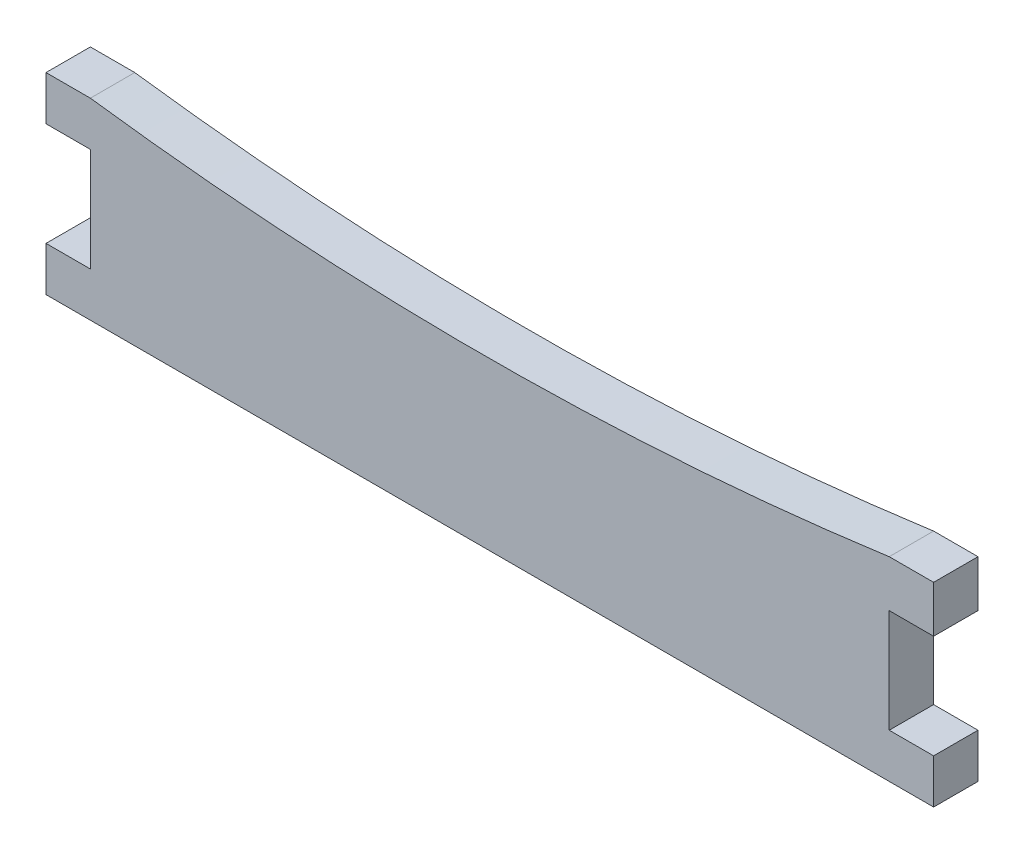
ISO-10303-21;
HEADER;
FILE_DESCRIPTION(('STEP AP214'),'2;1');
FILE_NAME('part.step','',(''),(''),'','','');
FILE_SCHEMA(('AUTOMOTIVE_DESIGN { 1 0 10303 214 1 1 1 1 }'));
ENDSEC;
DATA;
#1=APPLICATION_CONTEXT('core data for automotive mechanical design processes');
#2=APPLICATION_PROTOCOL_DEFINITION('international standard','automotive_design',2000,#1);
#3=PRODUCT_CONTEXT('',#1,'mechanical');
#4=PRODUCT('Part','Part','',(#3));
#5=PRODUCT_RELATED_PRODUCT_CATEGORY('part','',(#4));
#6=PRODUCT_DEFINITION_FORMATION('','',#4);
#7=PRODUCT_DEFINITION_CONTEXT('part definition',#1,'design');
#8=PRODUCT_DEFINITION('design','',#6,#7);
#9=PRODUCT_DEFINITION_SHAPE('','',#8);
#10=(LENGTH_UNIT() NAMED_UNIT(*) SI_UNIT(.MILLI.,.METRE.));
#11=(NAMED_UNIT(*) PLANE_ANGLE_UNIT() SI_UNIT($,.RADIAN.));
#12=(NAMED_UNIT(*) SI_UNIT($,.STERADIAN.) SOLID_ANGLE_UNIT());
#13=UNCERTAINTY_MEASURE_WITH_UNIT(LENGTH_MEASURE(1.E-05),#10,'distance_accuracy_value','');
#14=(GEOMETRIC_REPRESENTATION_CONTEXT(3) GLOBAL_UNCERTAINTY_ASSIGNED_CONTEXT((#13)) GLOBAL_UNIT_ASSIGNED_CONTEXT((#10,
#11,#12)) REPRESENTATION_CONTEXT('',''));
#15=CARTESIAN_POINT('',(0.,0.,0.));
#16=DIRECTION('',(0.,0.,1.));
#17=DIRECTION('',(1.,0.,0.));
#18=AXIS2_PLACEMENT_3D('',#15,#16,#17);
#19=CARTESIAN_POINT('',(-38.1,0.,3.81));
#20=DIRECTION('',(1.,0.,0.));
#21=DIRECTION('',(0.,0.,-1.));
#22=AXIS2_PLACEMENT_3D('',#19,#20,#21);
#23=PLANE('',#22);
#24=DIRECTION('',(0.,-1.,0.));
#25=VECTOR('',#24,1.);
#26=CARTESIAN_POINT('',(-38.1,0.,0.));
#27=LINE('',#26,#25);
#28=CARTESIAN_POINT('',(-38.1,3.81,0.));
#29=VERTEX_POINT('',#28);
#30=CARTESIAN_POINT('',(-38.1,0.,0.));
#31=VERTEX_POINT('',#30);
#32=EDGE_CURVE('E165',#29,#31,#27,.T.);
#33=ORIENTED_EDGE('',*,*,#32,.T.);
#34=DIRECTION('',(0.,0.,-1.));
#35=VECTOR('',#34,1.);
#36=CARTESIAN_POINT('',(-38.1,0.,3.81));
#37=LINE('',#36,#35);
#38=CARTESIAN_POINT('',(-38.1,0.,3.81));
#39=VERTEX_POINT('',#38);
#40=EDGE_CURVE('E11',#39,#31,#37,.T.);
#41=ORIENTED_EDGE('',*,*,#40,.F.);
#42=DIRECTION('',(0.,-1.,0.));
#43=VECTOR('',#42,1.);
#44=CARTESIAN_POINT('',(-38.1,0.,3.81));
#45=LINE('',#44,#43);
#46=CARTESIAN_POINT('',(-38.1,3.81,3.81));
#47=VERTEX_POINT('',#46);
#48=EDGE_CURVE('E191',#47,#39,#45,.T.);
#49=ORIENTED_EDGE('',*,*,#48,.F.);
#50=DIRECTION('',(0.,0.,-1.));
#51=VECTOR('',#50,1.);
#52=CARTESIAN_POINT('',(-38.1,3.81,3.81));
#53=LINE('',#52,#51);
#54=EDGE_CURVE('E161',#47,#29,#53,.T.);
#55=ORIENTED_EDGE('',*,*,#54,.T.);
#56=EDGE_LOOP('',(#33,#41,#49,#55));
#57=FACE_BOUND('',#56,.T.);
#58=ADVANCED_FACE('F33',(#57),#23,.F.);
#59=CARTESIAN_POINT('',(-38.1,0.,3.81));
#60=DIRECTION('',(0.,1.,0.));
#61=DIRECTION('',(0.,0.,1.));
#62=AXIS2_PLACEMENT_3D('',#59,#60,#61);
#63=PLANE('',#62);
#64=DIRECTION('',(1.,0.,0.));
#65=VECTOR('',#64,1.);
#66=CARTESIAN_POINT('',(-38.1,0.,0.));
#67=LINE('',#66,#65);
#68=CARTESIAN_POINT('',(38.1,0.,0.));
#69=VERTEX_POINT('',#68);
#70=EDGE_CURVE('E168',#31,#69,#67,.T.);
#71=ORIENTED_EDGE('',*,*,#70,.T.);
#72=DIRECTION('',(0.,0.,-1.));
#73=VECTOR('',#72,1.);
#74=CARTESIAN_POINT('',(38.1,0.,3.81));
#75=LINE('',#74,#73);
#76=CARTESIAN_POINT('',(38.1,0.,3.81));
#77=VERTEX_POINT('',#76);
#78=EDGE_CURVE('E41',#77,#69,#75,.T.);
#79=ORIENTED_EDGE('',*,*,#78,.F.);
#80=DIRECTION('',(1.,0.,0.));
#81=VECTOR('',#80,1.);
#82=CARTESIAN_POINT('',(-38.1,0.,3.81));
#83=LINE('',#82,#81);
#84=EDGE_CURVE('E110',#39,#77,#83,.T.);
#85=ORIENTED_EDGE('',*,*,#84,.F.);
#86=ORIENTED_EDGE('',*,*,#40,.T.);
#87=EDGE_LOOP('',(#71,#79,#85,#86));
#88=FACE_BOUND('',#87,.T.);
#89=ADVANCED_FACE('F279',(#88),#63,.F.);
#90=CARTESIAN_POINT('',(38.1,0.,3.81));
#91=DIRECTION('',(-1.,0.,0.));
#92=DIRECTION('',(0.,0.,1.));
#93=AXIS2_PLACEMENT_3D('',#90,#91,#92);
#94=PLANE('',#93);
#95=DIRECTION('',(0.,1.,0.));
#96=VECTOR('',#95,1.);
#97=CARTESIAN_POINT('',(38.1,0.,0.));
#98=LINE('',#97,#96);
#99=CARTESIAN_POINT('',(38.1,3.81,0.));
#100=VERTEX_POINT('',#99);
#101=EDGE_CURVE('E170',#69,#100,#98,.T.);
#102=ORIENTED_EDGE('',*,*,#101,.T.);
#103=DIRECTION('',(0.,0.,-1.));
#104=VECTOR('',#103,1.);
#105=CARTESIAN_POINT('',(38.1,3.81,3.81));
#106=LINE('',#105,#104);
#107=CARTESIAN_POINT('',(38.1,3.81,3.81));
#108=VERTEX_POINT('',#107);
#109=EDGE_CURVE('E216',#108,#100,#106,.T.);
#110=ORIENTED_EDGE('',*,*,#109,.F.);
#111=DIRECTION('',(0.,1.,0.));
#112=VECTOR('',#111,1.);
#113=CARTESIAN_POINT('',(38.1,0.,3.81));
#114=LINE('',#113,#112);
#115=EDGE_CURVE('E224',#77,#108,#114,.T.);
#116=ORIENTED_EDGE('',*,*,#115,.F.);
#117=ORIENTED_EDGE('',*,*,#78,.T.);
#118=EDGE_LOOP('',(#102,#110,#116,#117));
#119=FACE_BOUND('',#118,.T.);
#120=ADVANCED_FACE('F222',(#119),#94,.F.);
#121=CARTESIAN_POINT('',(38.1,3.81,3.81));
#122=DIRECTION('',(0.,-1.,0.));
#123=DIRECTION('',(1.,0.,0.));
#124=AXIS2_PLACEMENT_3D('',#121,#122,#123);
#125=PLANE('',#124);
#126=DIRECTION('',(-1.,0.,0.));
#127=VECTOR('',#126,1.);
#128=CARTESIAN_POINT('',(38.1,3.81,0.));
#129=LINE('',#128,#127);
#130=CARTESIAN_POINT('',(34.29,3.81,0.));
#131=VERTEX_POINT('',#130);
#132=EDGE_CURVE('E172',#100,#131,#129,.T.);
#133=ORIENTED_EDGE('',*,*,#132,.T.);
#134=DIRECTION('',(0.,0.,-1.));
#135=VECTOR('',#134,1.);
#136=CARTESIAN_POINT('',(34.29,3.81,3.81));
#137=LINE('',#136,#135);
#138=CARTESIAN_POINT('',(34.29,3.81,3.81));
#139=VERTEX_POINT('',#138);
#140=EDGE_CURVE('E213',#139,#131,#137,.T.);
#141=ORIENTED_EDGE('',*,*,#140,.F.);
#142=DIRECTION('',(-1.,0.,0.));
#143=VECTOR('',#142,1.);
#144=CARTESIAN_POINT('',(38.1,3.81,3.81));
#145=LINE('',#144,#143);
#146=EDGE_CURVE('E242',#108,#139,#145,.T.);
#147=ORIENTED_EDGE('',*,*,#146,.F.);
#148=ORIENTED_EDGE('',*,*,#109,.T.);
#149=EDGE_LOOP('',(#133,#141,#147,#148));
#150=FACE_BOUND('',#149,.T.);
#151=ADVANCED_FACE('F233',(#150),#125,.F.);
#152=CARTESIAN_POINT('',(34.29,3.81,3.81));
#153=DIRECTION('',(-1.,0.,0.));
#154=DIRECTION('',(0.,0.,1.));
#155=AXIS2_PLACEMENT_3D('',#152,#153,#154);
#156=PLANE('',#155);
#157=DIRECTION('',(0.,1.,0.));
#158=VECTOR('',#157,1.);
#159=CARTESIAN_POINT('',(34.29,3.81,0.));
#160=LINE('',#159,#158);
#161=CARTESIAN_POINT('',(34.29,12.7,0.));
#162=VERTEX_POINT('',#161);
#163=EDGE_CURVE('E174',#131,#162,#160,.T.);
#164=ORIENTED_EDGE('',*,*,#163,.T.);
#165=DIRECTION('',(0.,0.,-1.));
#166=VECTOR('',#165,1.);
#167=CARTESIAN_POINT('',(34.29,12.7,3.81));
#168=LINE('',#167,#166);
#169=CARTESIAN_POINT('',(34.29,12.7,3.81));
#170=VERTEX_POINT('',#169);
#171=EDGE_CURVE('E210',#170,#162,#168,.T.);
#172=ORIENTED_EDGE('',*,*,#171,.F.);
#173=DIRECTION('',(0.,1.,0.));
#174=VECTOR('',#173,1.);
#175=CARTESIAN_POINT('',(34.29,3.81,3.81));
#176=LINE('',#175,#174);
#177=EDGE_CURVE('E239',#139,#170,#176,.T.);
#178=ORIENTED_EDGE('',*,*,#177,.F.);
#179=ORIENTED_EDGE('',*,*,#140,.T.);
#180=EDGE_LOOP('',(#164,#172,#178,#179));
#181=FACE_BOUND('',#180,.T.);
#182=ADVANCED_FACE('F237',(#181),#156,.F.);
#183=CARTESIAN_POINT('',(34.29,12.7,3.81));
#184=DIRECTION('',(0.,1.,0.));
#185=DIRECTION('',(-1.,0.,0.));
#186=AXIS2_PLACEMENT_3D('',#183,#184,#185);
#187=PLANE('',#186);
#188=DIRECTION('',(1.,0.,0.));
#189=VECTOR('',#188,1.);
#190=CARTESIAN_POINT('',(34.29,12.7,0.));
#191=LINE('',#190,#189);
#192=CARTESIAN_POINT('',(38.1,12.7,0.));
#193=VERTEX_POINT('',#192);
#194=EDGE_CURVE('E176',#162,#193,#191,.T.);
#195=ORIENTED_EDGE('',*,*,#194,.T.);
#196=DIRECTION('',(0.,0.,-1.));
#197=VECTOR('',#196,1.);
#198=CARTESIAN_POINT('',(38.1,12.7,3.81));
#199=LINE('',#198,#197);
#200=CARTESIAN_POINT('',(38.1,12.7,3.81));
#201=VERTEX_POINT('',#200);
#202=EDGE_CURVE('E207',#201,#193,#199,.T.);
#203=ORIENTED_EDGE('',*,*,#202,.F.);
#204=DIRECTION('',(1.,0.,0.));
#205=VECTOR('',#204,1.);
#206=CARTESIAN_POINT('',(34.29,12.7,3.81));
#207=LINE('',#206,#205);
#208=EDGE_CURVE('E241',#170,#201,#207,.T.);
#209=ORIENTED_EDGE('',*,*,#208,.F.);
#210=ORIENTED_EDGE('',*,*,#171,.T.);
#211=EDGE_LOOP('',(#195,#203,#209,#210));
#212=FACE_BOUND('',#211,.T.);
#213=ADVANCED_FACE('F292',(#212),#187,.F.);
#214=CARTESIAN_POINT('',(38.1,12.7,3.81));
#215=DIRECTION('',(-1.,0.,0.));
#216=DIRECTION('',(0.,0.,1.));
#217=AXIS2_PLACEMENT_3D('',#214,#215,#216);
#218=PLANE('',#217);
#219=DIRECTION('',(0.,1.,0.));
#220=VECTOR('',#219,1.);
#221=CARTESIAN_POINT('',(38.1,12.7,0.));
#222=LINE('',#221,#220);
#223=CARTESIAN_POINT('',(38.1,16.711046712555,0.));
#224=VERTEX_POINT('',#223);
#225=EDGE_CURVE('E178',#193,#224,#222,.T.);
#226=ORIENTED_EDGE('',*,*,#225,.T.);
#227=DIRECTION('',(0.,0.,-1.));
#228=VECTOR('',#227,1.);
#229=CARTESIAN_POINT('',(38.1,16.711046712555,3.81));
#230=LINE('',#229,#228);
#231=CARTESIAN_POINT('',(38.1,16.711046712555,3.81));
#232=VERTEX_POINT('',#231);
#233=EDGE_CURVE('E204',#232,#224,#230,.T.);
#234=ORIENTED_EDGE('',*,*,#233,.F.);
#235=DIRECTION('',(0.,1.,0.));
#236=VECTOR('',#235,1.);
#237=CARTESIAN_POINT('',(38.1,12.7,3.81));
#238=LINE('',#237,#236);
#239=EDGE_CURVE('E244',#201,#232,#238,.T.);
#240=ORIENTED_EDGE('',*,*,#239,.F.);
#241=ORIENTED_EDGE('',*,*,#202,.T.);
#242=EDGE_LOOP('',(#226,#234,#240,#241));
#243=FACE_BOUND('',#242,.T.);
#244=ADVANCED_FACE('F295',(#243),#218,.F.);
#245=CARTESIAN_POINT('',(38.1,16.711046712555,3.81));
#246=DIRECTION('',(0.,-1.,0.));
#247=DIRECTION('',(0.,0.,-1.));
#248=AXIS2_PLACEMENT_3D('',#245,#246,#247);
#249=PLANE('',#248);
#250=DIRECTION('',(-1.,0.,0.));
#251=VECTOR('',#250,1.);
#252=CARTESIAN_POINT('',(38.1,16.711046712555,0.));
#253=LINE('',#252,#251);
#254=CARTESIAN_POINT('',(34.29,16.711046712555,0.));
#255=VERTEX_POINT('',#254);
#256=EDGE_CURVE('E180',#224,#255,#253,.T.);
#257=ORIENTED_EDGE('',*,*,#256,.T.);
#258=DIRECTION('',(0.,0.,-1.));
#259=VECTOR('',#258,1.);
#260=CARTESIAN_POINT('',(34.29,16.711046712555,3.81));
#261=LINE('',#260,#259);
#262=CARTESIAN_POINT('',(34.29,16.711046712555,3.81));
#263=VERTEX_POINT('',#262);
#264=EDGE_CURVE('E201',#263,#255,#261,.T.);
#265=ORIENTED_EDGE('',*,*,#264,.F.);
#266=DIRECTION('',(-1.,0.,0.));
#267=VECTOR('',#266,1.);
#268=CARTESIAN_POINT('',(38.1,16.711046712555,3.81));
#269=LINE('',#268,#267);
#270=EDGE_CURVE('E250',#232,#263,#269,.T.);
#271=ORIENTED_EDGE('',*,*,#270,.F.);
#272=ORIENTED_EDGE('',*,*,#233,.T.);
#273=EDGE_LOOP('',(#257,#265,#271,#272));
#274=FACE_BOUND('',#273,.T.);
#275=ADVANCED_FACE('F299',(#274),#249,.F.);
#276=CARTESIAN_POINT('',(-0.737797697556429,268.284203842761,3.81));
#277=DIRECTION('',(0.,0.,-1.));
#278=DIRECTION('',(-1.,0.,0.));
#279=AXIS2_PLACEMENT_3D('',#276,#277,#278);
#280=CYLINDRICAL_SURFACE('',#279,254.);
#281=CARTESIAN_POINT('',(-0.737797697556429,268.284203842761,0.));
#282=DIRECTION('',(0.,0.,-1.));
#283=DIRECTION('',(1.,0.,0.));
#284=AXIS2_PLACEMENT_3D('',#281,#282,#283);
#285=CIRCLE('',#284,254.);
#286=CARTESIAN_POINT('',(-34.29,16.51,0.));
#287=VERTEX_POINT('',#286);
#288=EDGE_CURVE('E182',#255,#287,#285,.T.);
#289=ORIENTED_EDGE('',*,*,#288,.T.);
#290=DIRECTION('',(0.,0.,-1.));
#291=VECTOR('',#290,1.);
#292=CARTESIAN_POINT('',(-34.29,16.51,3.81));
#293=LINE('',#292,#291);
#294=CARTESIAN_POINT('',(-34.29,16.51,3.81));
#295=VERTEX_POINT('',#294);
#296=EDGE_CURVE('E198',#295,#287,#293,.T.);
#297=ORIENTED_EDGE('',*,*,#296,.F.);
#298=CARTESIAN_POINT('',(-0.737797697556429,268.284203842761,3.81));
#299=DIRECTION('',(0.,0.,-1.));
#300=DIRECTION('',(1.,0.,0.));
#301=AXIS2_PLACEMENT_3D('',#298,#299,#300);
#302=CIRCLE('',#301,254.);
#303=EDGE_CURVE('E252',#263,#295,#302,.T.);
#304=ORIENTED_EDGE('',*,*,#303,.F.);
#305=ORIENTED_EDGE('',*,*,#264,.T.);
#306=EDGE_LOOP('',(#289,#297,#304,#305));
#307=FACE_BOUND('',#306,.T.);
#308=ADVANCED_FACE('F303',(#307),#280,.F.);
#309=CARTESIAN_POINT('',(-38.1,16.51,3.81));
#310=DIRECTION('',(0.,-1.,0.));
#311=DIRECTION('',(0.,0.,-1.));
#312=AXIS2_PLACEMENT_3D('',#309,#310,#311);
#313=PLANE('',#312);
#314=DIRECTION('',(-1.,0.,0.));
#315=VECTOR('',#314,1.);
#316=CARTESIAN_POINT('',(-38.1,16.51,0.));
#317=LINE('',#316,#315);
#318=CARTESIAN_POINT('',(-38.1,16.51,0.));
#319=VERTEX_POINT('',#318);
#320=EDGE_CURVE('E184',#287,#319,#317,.T.);
#321=ORIENTED_EDGE('',*,*,#320,.T.);
#322=DIRECTION('',(0.,0.,-1.));
#323=VECTOR('',#322,1.);
#324=CARTESIAN_POINT('',(-38.1,16.51,3.81));
#325=LINE('',#324,#323);
#326=CARTESIAN_POINT('',(-38.1,16.51,3.81));
#327=VERTEX_POINT('',#326);
#328=EDGE_CURVE('E195',#327,#319,#325,.T.);
#329=ORIENTED_EDGE('',*,*,#328,.F.);
#330=DIRECTION('',(-1.,0.,0.));
#331=VECTOR('',#330,1.);
#332=CARTESIAN_POINT('',(-38.1,16.51,3.81));
#333=LINE('',#332,#331);
#334=EDGE_CURVE('E254',#295,#327,#333,.T.);
#335=ORIENTED_EDGE('',*,*,#334,.F.);
#336=ORIENTED_EDGE('',*,*,#296,.T.);
#337=EDGE_LOOP('',(#321,#329,#335,#336));
#338=FACE_BOUND('',#337,.T.);
#339=ADVANCED_FACE('F260',(#338),#313,.F.);
#340=CARTESIAN_POINT('',(-38.1,12.7,3.81));
#341=DIRECTION('',(1.,0.,0.));
#342=DIRECTION('',(0.,0.,-1.));
#343=AXIS2_PLACEMENT_3D('',#340,#341,#342);
#344=PLANE('',#343);
#345=DIRECTION('',(0.,-1.,0.));
#346=VECTOR('',#345,1.);
#347=CARTESIAN_POINT('',(-38.1,12.7,0.));
#348=LINE('',#347,#346);
#349=CARTESIAN_POINT('',(-38.1,12.7,0.));
#350=VERTEX_POINT('',#349);
#351=EDGE_CURVE('E186',#319,#350,#348,.T.);
#352=ORIENTED_EDGE('',*,*,#351,.T.);
#353=DIRECTION('',(0.,0.,-1.));
#354=VECTOR('',#353,1.);
#355=CARTESIAN_POINT('',(-38.1,12.7,3.81));
#356=LINE('',#355,#354);
#357=CARTESIAN_POINT('',(-38.1,12.7,3.81));
#358=VERTEX_POINT('',#357);
#359=EDGE_CURVE('E156',#358,#350,#356,.T.);
#360=ORIENTED_EDGE('',*,*,#359,.F.);
#361=DIRECTION('',(0.,-1.,0.));
#362=VECTOR('',#361,1.);
#363=CARTESIAN_POINT('',(-38.1,12.7,3.81));
#364=LINE('',#363,#362);
#365=EDGE_CURVE('E147',#327,#358,#364,.T.);
#366=ORIENTED_EDGE('',*,*,#365,.F.);
#367=ORIENTED_EDGE('',*,*,#328,.T.);
#368=EDGE_LOOP('',(#352,#360,#366,#367));
#369=FACE_BOUND('',#368,.T.);
#370=ADVANCED_FACE('F264',(#369),#344,.F.);
#371=CARTESIAN_POINT('',(-34.29,12.7,3.81));
#372=DIRECTION('',(0.,1.,0.));
#373=DIRECTION('',(-1.,0.,0.));
#374=AXIS2_PLACEMENT_3D('',#371,#372,#373);
#375=PLANE('',#374);
#376=DIRECTION('',(1.,0.,0.));
#377=VECTOR('',#376,1.);
#378=CARTESIAN_POINT('',(-34.29,12.7,0.));
#379=LINE('',#378,#377);
#380=CARTESIAN_POINT('',(-34.29,12.7,0.));
#381=VERTEX_POINT('',#380);
#382=EDGE_CURVE('E155',#350,#381,#379,.T.);
#383=ORIENTED_EDGE('',*,*,#382,.T.);
#384=DIRECTION('',(0.,0.,-1.));
#385=VECTOR('',#384,1.);
#386=CARTESIAN_POINT('',(-34.29,12.7,3.81));
#387=LINE('',#386,#385);
#388=CARTESIAN_POINT('',(-34.29,12.7,3.81));
#389=VERTEX_POINT('',#388);
#390=EDGE_CURVE('E152',#389,#381,#387,.T.);
#391=ORIENTED_EDGE('',*,*,#390,.F.);
#392=DIRECTION('',(1.,0.,0.));
#393=VECTOR('',#392,1.);
#394=CARTESIAN_POINT('',(-34.29,12.7,3.81));
#395=LINE('',#394,#393);
#396=EDGE_CURVE('E141',#358,#389,#395,.T.);
#397=ORIENTED_EDGE('',*,*,#396,.F.);
#398=ORIENTED_EDGE('',*,*,#359,.T.);
#399=EDGE_LOOP('',(#383,#391,#397,#398));
#400=FACE_BOUND('',#399,.T.);
#401=ADVANCED_FACE('F153',(#400),#375,.F.);
#402=CARTESIAN_POINT('',(-34.29,3.81,3.81));
#403=DIRECTION('',(1.,0.,0.));
#404=DIRECTION('',(0.,0.,-1.));
#405=AXIS2_PLACEMENT_3D('',#402,#403,#404);
#406=PLANE('',#405);
#407=DIRECTION('',(0.,-1.,0.));
#408=VECTOR('',#407,1.);
#409=CARTESIAN_POINT('',(-34.29,3.81,0.));
#410=LINE('',#409,#408);
#411=CARTESIAN_POINT('',(-34.29,3.81,0.));
#412=VERTEX_POINT('',#411);
#413=EDGE_CURVE('E96',#381,#412,#410,.T.);
#414=ORIENTED_EDGE('',*,*,#413,.T.);
#415=DIRECTION('',(0.,0.,-1.));
#416=VECTOR('',#415,1.);
#417=CARTESIAN_POINT('',(-34.29,3.81,3.81));
#418=LINE('',#417,#416);
#419=CARTESIAN_POINT('',(-34.29,3.81,3.81));
#420=VERTEX_POINT('',#419);
#421=EDGE_CURVE('E157',#420,#412,#418,.T.);
#422=ORIENTED_EDGE('',*,*,#421,.F.);
#423=DIRECTION('',(0.,-1.,0.));
#424=VECTOR('',#423,1.);
#425=CARTESIAN_POINT('',(-34.29,3.81,3.81));
#426=LINE('',#425,#424);
#427=EDGE_CURVE('E145',#389,#420,#426,.T.);
#428=ORIENTED_EDGE('',*,*,#427,.F.);
#429=ORIENTED_EDGE('',*,*,#390,.T.);
#430=EDGE_LOOP('',(#414,#422,#428,#429));
#431=FACE_BOUND('',#430,.T.);
#432=ADVANCED_FACE('F159',(#431),#406,.F.);
#433=CARTESIAN_POINT('',(-38.1,3.81,3.81));
#434=DIRECTION('',(0.,-1.,0.));
#435=DIRECTION('',(0.,0.,-1.));
#436=AXIS2_PLACEMENT_3D('',#433,#434,#435);
#437=PLANE('',#436);
#438=DIRECTION('',(-1.,0.,0.));
#439=VECTOR('',#438,1.);
#440=CARTESIAN_POINT('',(-38.1,3.81,0.));
#441=LINE('',#440,#439);
#442=EDGE_CURVE('E102',#412,#29,#441,.T.);
#443=ORIENTED_EDGE('',*,*,#442,.T.);
#444=ORIENTED_EDGE('',*,*,#54,.F.);
#445=DIRECTION('',(-1.,0.,0.));
#446=VECTOR('',#445,1.);
#447=CARTESIAN_POINT('',(-38.1,3.81,3.81));
#448=LINE('',#447,#446);
#449=EDGE_CURVE('E49',#420,#47,#448,.T.);
#450=ORIENTED_EDGE('',*,*,#449,.F.);
#451=ORIENTED_EDGE('',*,*,#421,.T.);
#452=EDGE_LOOP('',(#443,#444,#450,#451));
#453=FACE_BOUND('',#452,.T.);
#454=ADVANCED_FACE('F268',(#453),#437,.F.);
#455=CARTESIAN_POINT('',(-0.737797697556429,268.284203842761,3.81));
#456=DIRECTION('',(0.,0.,1.));
#457=DIRECTION('',(1.,0.,0.));
#458=AXIS2_PLACEMENT_3D('',#455,#456,#457);
#459=PLANE('',#458);
#460=ORIENTED_EDGE('',*,*,#48,.T.);
#461=ORIENTED_EDGE('',*,*,#84,.T.);
#462=ORIENTED_EDGE('',*,*,#115,.T.);
#463=ORIENTED_EDGE('',*,*,#146,.T.);
#464=ORIENTED_EDGE('',*,*,#177,.T.);
#465=ORIENTED_EDGE('',*,*,#208,.T.);
#466=ORIENTED_EDGE('',*,*,#239,.T.);
#467=ORIENTED_EDGE('',*,*,#270,.T.);
#468=ORIENTED_EDGE('',*,*,#303,.T.);
#469=ORIENTED_EDGE('',*,*,#334,.T.);
#470=ORIENTED_EDGE('',*,*,#365,.T.);
#471=ORIENTED_EDGE('',*,*,#396,.T.);
#472=ORIENTED_EDGE('',*,*,#427,.T.);
#473=ORIENTED_EDGE('',*,*,#449,.T.);
#474=EDGE_LOOP('',(#460,#461,#462,#463,#464,#465,#466,#467,#468,#469,#470,#471,#472,#473));
#475=FACE_BOUND('',#474,.T.);
#476=ADVANCED_FACE('F143',(#475),#459,.T.);
#477=CARTESIAN_POINT('',(-0.737797697556429,268.284203842761,0.));
#478=DIRECTION('',(0.,0.,1.));
#479=DIRECTION('',(1.,0.,0.));
#480=AXIS2_PLACEMENT_3D('',#477,#478,#479);
#481=PLANE('',#480);
#482=ORIENTED_EDGE('',*,*,#32,.F.);
#483=ORIENTED_EDGE('',*,*,#442,.F.);
#484=ORIENTED_EDGE('',*,*,#413,.F.);
#485=ORIENTED_EDGE('',*,*,#382,.F.);
#486=ORIENTED_EDGE('',*,*,#351,.F.);
#487=ORIENTED_EDGE('',*,*,#320,.F.);
#488=ORIENTED_EDGE('',*,*,#288,.F.);
#489=ORIENTED_EDGE('',*,*,#256,.F.);
#490=ORIENTED_EDGE('',*,*,#225,.F.);
#491=ORIENTED_EDGE('',*,*,#194,.F.);
#492=ORIENTED_EDGE('',*,*,#163,.F.);
#493=ORIENTED_EDGE('',*,*,#132,.F.);
#494=ORIENTED_EDGE('',*,*,#101,.F.);
#495=ORIENTED_EDGE('',*,*,#70,.F.);
#496=EDGE_LOOP('',(#482,#483,#484,#485,#486,#487,#488,#489,#490,#491,#492,#493,#494,#495));
#497=FACE_BOUND('',#496,.T.);
#498=ADVANCED_FACE('F228',(#497),#481,.F.);
#499=CLOSED_SHELL('',(#58,#89,#120,#151,#182,#213,#244,#275,#308,#339,#370,#401,#432,#454,#476,#498));
#500=MANIFOLD_SOLID_BREP('B2',#499);
#501=ADVANCED_BREP_SHAPE_REPRESENTATION('',(#18,#500),#14);
#502=SHAPE_DEFINITION_REPRESENTATION(#9,#501);
ENDSEC;
END-ISO-10303-21;
